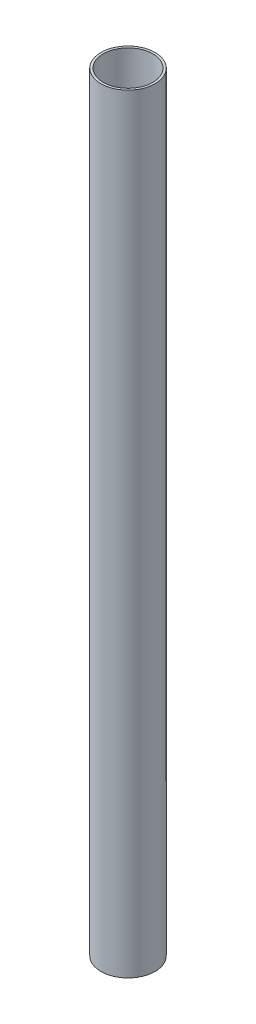
ISO-10303-21;
HEADER;
FILE_DESCRIPTION(('STEP AP214'),'2;1');
FILE_NAME('part.step','',(''),(''),'','','');
FILE_SCHEMA(('AUTOMOTIVE_DESIGN { 1 0 10303 214 1 1 1 1 }'));
ENDSEC;
DATA;
#1=APPLICATION_CONTEXT('core data for automotive mechanical design processes');
#2=APPLICATION_PROTOCOL_DEFINITION('international standard','automotive_design',2000,#1);
#3=PRODUCT_CONTEXT('',#1,'mechanical');
#4=PRODUCT('Part','Part','',(#3));
#5=PRODUCT_RELATED_PRODUCT_CATEGORY('part','',(#4));
#6=PRODUCT_DEFINITION_FORMATION('','',#4);
#7=PRODUCT_DEFINITION_CONTEXT('part definition',#1,'design');
#8=PRODUCT_DEFINITION('design','',#6,#7);
#9=PRODUCT_DEFINITION_SHAPE('','',#8);
#10=(LENGTH_UNIT() NAMED_UNIT(*) SI_UNIT(.MILLI.,.METRE.));
#11=(NAMED_UNIT(*) PLANE_ANGLE_UNIT() SI_UNIT($,.RADIAN.));
#12=(NAMED_UNIT(*) SI_UNIT($,.STERADIAN.) SOLID_ANGLE_UNIT());
#13=UNCERTAINTY_MEASURE_WITH_UNIT(LENGTH_MEASURE(1.E-05),#10,'distance_accuracy_value','');
#14=(GEOMETRIC_REPRESENTATION_CONTEXT(3) GLOBAL_UNCERTAINTY_ASSIGNED_CONTEXT((#13)) GLOBAL_UNIT_ASSIGNED_CONTEXT((#10,
#11,#12)) REPRESENTATION_CONTEXT('',''));
#15=CARTESIAN_POINT('',(0.,0.,0.));
#16=DIRECTION('',(0.,0.,1.));
#17=DIRECTION('',(1.,0.,0.));
#18=AXIS2_PLACEMENT_3D('',#15,#16,#17);
#19=CARTESIAN_POINT('',(0.,450.85,0.));
#20=DIRECTION('',(0.,1.,0.));
#21=DIRECTION('',(0.,0.,1.));
#22=AXIS2_PLACEMENT_3D('',#19,#20,#21);
#23=PLANE('',#22);
#24=CARTESIAN_POINT('',(0.,450.85,0.));
#25=DIRECTION('',(0.,1.,0.));
#26=DIRECTION('',(0.,0.,1.));
#27=AXIS2_PLACEMENT_3D('',#24,#25,#26);
#28=CIRCLE('',#27,15.875);
#29=CARTESIAN_POINT('',(0.,450.85,-15.875));
#30=VERTEX_POINT('',#29);
#31=EDGE_CURVE('E11',#30,#30,#28,.T.);
#32=ORIENTED_EDGE('',*,*,#31,.T.);
#33=EDGE_LOOP('',(#32));
#34=FACE_BOUND('',#33,.T.);
#35=CARTESIAN_POINT('',(0.,450.85,0.));
#36=DIRECTION('',(0.,1.,0.));
#37=DIRECTION('',(1.,0.,0.));
#38=AXIS2_PLACEMENT_3D('',#35,#36,#37);
#39=CIRCLE('',#38,14.5288);
#40=CARTESIAN_POINT('',(0.,450.85,-14.5288));
#41=VERTEX_POINT('',#40);
#42=EDGE_CURVE('E52',#41,#41,#39,.T.);
#43=ORIENTED_EDGE('',*,*,#42,.F.);
#44=EDGE_LOOP('',(#43));
#45=FACE_BOUND('',#44,.T.);
#46=ADVANCED_FACE('F41',(#34,#45),#23,.T.);
#47=CARTESIAN_POINT('',(0.,0.,0.));
#48=DIRECTION('',(0.,1.,0.));
#49=DIRECTION('',(0.,0.,1.));
#50=AXIS2_PLACEMENT_3D('',#47,#48,#49);
#51=PLANE('',#50);
#52=CARTESIAN_POINT('',(0.,0.,0.));
#53=DIRECTION('',(0.,1.,0.));
#54=DIRECTION('',(0.,0.,1.));
#55=AXIS2_PLACEMENT_3D('',#52,#53,#54);
#56=CIRCLE('',#55,15.875);
#57=CARTESIAN_POINT('',(0.,0.,-15.875));
#58=VERTEX_POINT('',#57);
#59=EDGE_CURVE('E45',#58,#58,#56,.T.);
#60=ORIENTED_EDGE('',*,*,#59,.F.);
#61=EDGE_LOOP('',(#60));
#62=FACE_BOUND('',#61,.T.);
#63=CARTESIAN_POINT('',(0.,0.,0.));
#64=DIRECTION('',(0.,1.,0.));
#65=DIRECTION('',(1.,0.,0.));
#66=AXIS2_PLACEMENT_3D('',#63,#64,#65);
#67=CIRCLE('',#66,14.5288);
#68=CARTESIAN_POINT('',(0.,0.,-14.5288));
#69=VERTEX_POINT('',#68);
#70=EDGE_CURVE('E54',#69,#69,#67,.T.);
#71=ORIENTED_EDGE('',*,*,#70,.T.);
#72=EDGE_LOOP('',(#71));
#73=FACE_BOUND('',#72,.T.);
#74=ADVANCED_FACE('F64',(#62,#73),#51,.F.);
#75=CARTESIAN_POINT('',(0.,450.85,0.));
#76=DIRECTION('',(0.,-1.,0.));
#77=DIRECTION('',(0.,0.,-1.));
#78=AXIS2_PLACEMENT_3D('',#75,#76,#77);
#79=CYLINDRICAL_SURFACE('',#78,15.875);
#80=CARTESIAN_POINT('',(0.,450.85,-15.875));
#81=CARTESIAN_POINT('',(0.,446.153645833333,-15.875));
#82=CARTESIAN_POINT('',(0.,441.457291666667,-15.875));
#83=CARTESIAN_POINT('',(0.,432.064583333333,-15.875));
#84=CARTESIAN_POINT('',(0.,427.368229166667,-15.875));
#85=CARTESIAN_POINT('',(0.,417.975520833333,-15.875));
#86=CARTESIAN_POINT('',(0.,413.279166666667,-15.875));
#87=CARTESIAN_POINT('',(0.,403.886458333333,-15.875));
#88=CARTESIAN_POINT('',(0.,399.190104166667,-15.875));
#89=CARTESIAN_POINT('',(0.,389.797395833333,-15.875));
#90=CARTESIAN_POINT('',(0.,385.101041666667,-15.875));
#91=CARTESIAN_POINT('',(0.,375.708333333333,-15.875));
#92=CARTESIAN_POINT('',(0.,371.011979166667,-15.875));
#93=CARTESIAN_POINT('',(0.,361.619270833333,-15.875));
#94=CARTESIAN_POINT('',(0.,356.922916666667,-15.875));
#95=CARTESIAN_POINT('',(0.,347.530208333333,-15.875));
#96=CARTESIAN_POINT('',(0.,342.833854166667,-15.875));
#97=CARTESIAN_POINT('',(0.,333.441145833333,-15.875));
#98=CARTESIAN_POINT('',(0.,328.744791666667,-15.875));
#99=CARTESIAN_POINT('',(0.,319.352083333333,-15.875));
#100=CARTESIAN_POINT('',(0.,314.655729166667,-15.875));
#101=CARTESIAN_POINT('',(0.,305.263020833333,-15.875));
#102=CARTESIAN_POINT('',(0.,300.566666666667,-15.875));
#103=CARTESIAN_POINT('',(0.,291.173958333333,-15.875));
#104=CARTESIAN_POINT('',(0.,286.477604166667,-15.875));
#105=CARTESIAN_POINT('',(0.,277.084895833333,-15.875));
#106=CARTESIAN_POINT('',(0.,272.388541666667,-15.875));
#107=CARTESIAN_POINT('',(0.,262.995833333333,-15.875));
#108=CARTESIAN_POINT('',(0.,258.299479166667,-15.875));
#109=CARTESIAN_POINT('',(0.,248.906770833333,-15.875));
#110=CARTESIAN_POINT('',(0.,244.210416666667,-15.875));
#111=CARTESIAN_POINT('',(0.,234.817708333333,-15.875));
#112=CARTESIAN_POINT('',(0.,230.121354166667,-15.875));
#113=CARTESIAN_POINT('',(0.,220.728645833333,-15.875));
#114=CARTESIAN_POINT('',(0.,216.032291666667,-15.875));
#115=CARTESIAN_POINT('',(0.,206.639583333333,-15.875));
#116=CARTESIAN_POINT('',(0.,201.943229166667,-15.875));
#117=CARTESIAN_POINT('',(0.,192.550520833333,-15.875));
#118=CARTESIAN_POINT('',(0.,187.854166666667,-15.875));
#119=CARTESIAN_POINT('',(0.,178.461458333333,-15.875));
#120=CARTESIAN_POINT('',(0.,173.765104166667,-15.875));
#121=CARTESIAN_POINT('',(0.,164.372395833333,-15.875));
#122=CARTESIAN_POINT('',(0.,159.676041666667,-15.875));
#123=CARTESIAN_POINT('',(0.,150.283333333333,-15.875));
#124=CARTESIAN_POINT('',(0.,145.586979166667,-15.875));
#125=CARTESIAN_POINT('',(0.,136.194270833333,-15.875));
#126=CARTESIAN_POINT('',(0.,131.497916666667,-15.875));
#127=CARTESIAN_POINT('',(0.,122.105208333333,-15.875));
#128=CARTESIAN_POINT('',(0.,117.408854166667,-15.875));
#129=CARTESIAN_POINT('',(0.,108.016145833333,-15.875));
#130=CARTESIAN_POINT('',(0.,103.319791666667,-15.875));
#131=CARTESIAN_POINT('',(0.,93.9270833333333,-15.875));
#132=CARTESIAN_POINT('',(0.,89.2307291666666,-15.875));
#133=CARTESIAN_POINT('',(0.,79.8380208333333,-15.875));
#134=CARTESIAN_POINT('',(0.,75.1416666666666,-15.875));
#135=CARTESIAN_POINT('',(0.,65.7489583333333,-15.875));
#136=CARTESIAN_POINT('',(0.,61.0526041666666,-15.875));
#137=CARTESIAN_POINT('',(0.,51.6598958333333,-15.875));
#138=CARTESIAN_POINT('',(0.,46.9635416666666,-15.875));
#139=CARTESIAN_POINT('',(0.,37.5708333333333,-15.875));
#140=CARTESIAN_POINT('',(0.,32.8744791666666,-15.875));
#141=CARTESIAN_POINT('',(0.,23.4817708333333,-15.875));
#142=CARTESIAN_POINT('',(0.,18.7854166666666,-15.875));
#143=CARTESIAN_POINT('',(0.,9.39270833333329,-15.875));
#144=CARTESIAN_POINT('',(0.,4.69635416666661,-15.875));
#145=CARTESIAN_POINT('',(0.,0.,-15.875));
#146=B_SPLINE_CURVE_WITH_KNOTS('',3,(#80,#81,#82,#83,#84,#85,#86,#87,#88,#89,#90,#91,#92,#93,
#94,#95,#96,#97,#98,#99,#100,#101,#102,#103,#104,#105,#106,#107,#108,#109,#110,#111,#112,#113,
#114,#115,#116,#117,#118,#119,#120,#121,#122,#123,#124,#125,#126,#127,#128,#129,#130,#131,#132,
#133,#134,#135,#136,#137,#138,#139,#140,#141,#142,#143,#144,#145),.UNSPECIFIED.,.F.,.F.,(4,2,2,
2,2,2,2,2,2,2,2,2,2,2,2,2,2,2,2,2,2,2,2,2,2,2,2,2,2,2,2,2,4),(0.,14.0890625,28.178125,
42.2671875,56.3562499999999,70.4453125,84.534375,98.6234375,112.7125,126.8015625,140.890625,
154.9796875,169.06875,183.1578125,197.246875,211.3359375,225.425,239.5140625,253.603125,
267.6921875,281.78125,295.8703125,309.959375,324.0484375,338.1375,352.2265625,366.315625,
380.4046875,394.49375,408.5828125,422.671875,436.7609375,450.85),.UNSPECIFIED.);
#147=EDGE_CURVE('BSEAM43',#30,#58,#146,.T.);
#148=ORIENTED_EDGE('',*,*,#31,.F.);
#149=ORIENTED_EDGE('',*,*,#59,.T.);
#150=ORIENTED_EDGE('',*,*,#147,.T.);
#151=ORIENTED_EDGE('',*,*,#147,.F.);
#152=EDGE_LOOP('',(#148,#150,#149,#151));
#153=FACE_BOUND('',#152,.T.);
#154=ADVANCED_FACE('F43',(#153),#79,.T.);
#155=CARTESIAN_POINT('',(0.,450.85,0.));
#156=DIRECTION('',(0.,-1.,0.));
#157=DIRECTION('',(0.,0.,-1.));
#158=AXIS2_PLACEMENT_3D('',#155,#156,#157);
#159=CYLINDRICAL_SURFACE('',#158,14.5288);
#160=CARTESIAN_POINT('',(0.,450.85,-14.5288));
#161=CARTESIAN_POINT('',(0.,446.153645833333,-14.5288));
#162=CARTESIAN_POINT('',(0.,441.457291666667,-14.5288));
#163=CARTESIAN_POINT('',(0.,432.064583333333,-14.5288));
#164=CARTESIAN_POINT('',(0.,427.368229166667,-14.5288));
#165=CARTESIAN_POINT('',(0.,417.975520833333,-14.5288));
#166=CARTESIAN_POINT('',(0.,413.279166666667,-14.5288));
#167=CARTESIAN_POINT('',(0.,403.886458333333,-14.5288));
#168=CARTESIAN_POINT('',(0.,399.190104166667,-14.5288));
#169=CARTESIAN_POINT('',(0.,389.797395833333,-14.5288));
#170=CARTESIAN_POINT('',(0.,385.101041666667,-14.5288));
#171=CARTESIAN_POINT('',(0.,375.708333333333,-14.5288));
#172=CARTESIAN_POINT('',(0.,371.011979166667,-14.5288));
#173=CARTESIAN_POINT('',(0.,361.619270833333,-14.5288));
#174=CARTESIAN_POINT('',(0.,356.922916666667,-14.5288));
#175=CARTESIAN_POINT('',(0.,347.530208333333,-14.5288));
#176=CARTESIAN_POINT('',(0.,342.833854166667,-14.5288));
#177=CARTESIAN_POINT('',(0.,333.441145833333,-14.5288));
#178=CARTESIAN_POINT('',(0.,328.744791666667,-14.5288));
#179=CARTESIAN_POINT('',(0.,319.352083333333,-14.5288));
#180=CARTESIAN_POINT('',(0.,314.655729166667,-14.5288));
#181=CARTESIAN_POINT('',(0.,305.263020833333,-14.5288));
#182=CARTESIAN_POINT('',(0.,300.566666666667,-14.5288));
#183=CARTESIAN_POINT('',(0.,291.173958333333,-14.5288));
#184=CARTESIAN_POINT('',(0.,286.477604166667,-14.5288));
#185=CARTESIAN_POINT('',(0.,277.084895833333,-14.5288));
#186=CARTESIAN_POINT('',(0.,272.388541666667,-14.5288));
#187=CARTESIAN_POINT('',(0.,262.995833333333,-14.5288));
#188=CARTESIAN_POINT('',(0.,258.299479166667,-14.5288));
#189=CARTESIAN_POINT('',(0.,248.906770833333,-14.5288));
#190=CARTESIAN_POINT('',(0.,244.210416666667,-14.5288));
#191=CARTESIAN_POINT('',(0.,234.817708333333,-14.5288));
#192=CARTESIAN_POINT('',(0.,230.121354166667,-14.5288));
#193=CARTESIAN_POINT('',(0.,220.728645833333,-14.5288));
#194=CARTESIAN_POINT('',(0.,216.032291666667,-14.5288));
#195=CARTESIAN_POINT('',(0.,206.639583333333,-14.5288));
#196=CARTESIAN_POINT('',(0.,201.943229166667,-14.5288));
#197=CARTESIAN_POINT('',(0.,192.550520833333,-14.5288));
#198=CARTESIAN_POINT('',(0.,187.854166666667,-14.5288));
#199=CARTESIAN_POINT('',(0.,178.461458333333,-14.5288));
#200=CARTESIAN_POINT('',(0.,173.765104166667,-14.5288));
#201=CARTESIAN_POINT('',(0.,164.372395833333,-14.5288));
#202=CARTESIAN_POINT('',(0.,159.676041666667,-14.5288));
#203=CARTESIAN_POINT('',(0.,150.283333333333,-14.5288));
#204=CARTESIAN_POINT('',(0.,145.586979166667,-14.5288));
#205=CARTESIAN_POINT('',(0.,136.194270833333,-14.5288));
#206=CARTESIAN_POINT('',(0.,131.497916666667,-14.5288));
#207=CARTESIAN_POINT('',(0.,122.105208333333,-14.5288));
#208=CARTESIAN_POINT('',(0.,117.408854166667,-14.5288));
#209=CARTESIAN_POINT('',(0.,108.016145833333,-14.5288));
#210=CARTESIAN_POINT('',(0.,103.319791666667,-14.5288));
#211=CARTESIAN_POINT('',(0.,93.9270833333333,-14.5288));
#212=CARTESIAN_POINT('',(0.,89.2307291666666,-14.5288));
#213=CARTESIAN_POINT('',(0.,79.8380208333333,-14.5288));
#214=CARTESIAN_POINT('',(0.,75.1416666666666,-14.5288));
#215=CARTESIAN_POINT('',(0.,65.7489583333333,-14.5288));
#216=CARTESIAN_POINT('',(0.,61.0526041666666,-14.5288));
#217=CARTESIAN_POINT('',(0.,51.6598958333333,-14.5288));
#218=CARTESIAN_POINT('',(0.,46.9635416666666,-14.5288));
#219=CARTESIAN_POINT('',(0.,37.5708333333333,-14.5288));
#220=CARTESIAN_POINT('',(0.,32.8744791666666,-14.5288));
#221=CARTESIAN_POINT('',(0.,23.4817708333333,-14.5288));
#222=CARTESIAN_POINT('',(0.,18.7854166666666,-14.5288));
#223=CARTESIAN_POINT('',(0.,9.39270833333329,-14.5288));
#224=CARTESIAN_POINT('',(0.,4.69635416666661,-14.5288));
#225=CARTESIAN_POINT('',(0.,0.,-14.5288));
#226=B_SPLINE_CURVE_WITH_KNOTS('',3,(#160,#161,#162,#163,#164,#165,#166,#167,#168,#169,#170,
#171,#172,#173,#174,#175,#176,#177,#178,#179,#180,#181,#182,#183,#184,#185,#186,#187,#188,#189,
#190,#191,#192,#193,#194,#195,#196,#197,#198,#199,#200,#201,#202,#203,#204,#205,#206,#207,#208,
#209,#210,#211,#212,#213,#214,#215,#216,#217,#218,#219,#220,#221,#222,#223,#224,#225),
.UNSPECIFIED.,.F.,.F.,(4,2,2,2,2,2,2,2,2,2,2,2,2,2,2,2,2,2,2,2,2,2,2,2,2,2,2,2,2,2,2,2,4),(0.,
14.0890625,28.1781250000001,42.2671875,56.3562500000001,70.4453125,84.5343750000001,98.6234375,
112.7125,126.8015625,140.890625,154.9796875,169.06875,183.1578125,197.246875,211.3359375,
225.425,239.5140625,253.603125,267.6921875,281.78125,295.8703125,309.959375,324.0484375,
338.1375,352.2265625,366.315625,380.4046875,394.49375,408.5828125,422.671875,436.7609375,
450.85),.UNSPECIFIED.);
#227=EDGE_CURVE('BSEAM60',#41,#69,#226,.T.);
#228=ORIENTED_EDGE('',*,*,#42,.T.);
#229=ORIENTED_EDGE('',*,*,#70,.F.);
#230=ORIENTED_EDGE('',*,*,#227,.T.);
#231=ORIENTED_EDGE('',*,*,#227,.F.);
#232=EDGE_LOOP('',(#228,#230,#229,#231));
#233=FACE_BOUND('',#232,.T.);
#234=ADVANCED_FACE('F60',(#233),#159,.F.);
#235=CLOSED_SHELL('',(#46,#74,#154,#234));
#236=MANIFOLD_SOLID_BREP('B2',#235);
#237=ADVANCED_BREP_SHAPE_REPRESENTATION('',(#18,#236),#14);
#238=SHAPE_DEFINITION_REPRESENTATION(#9,#237);
ENDSEC;
END-ISO-10303-21;
